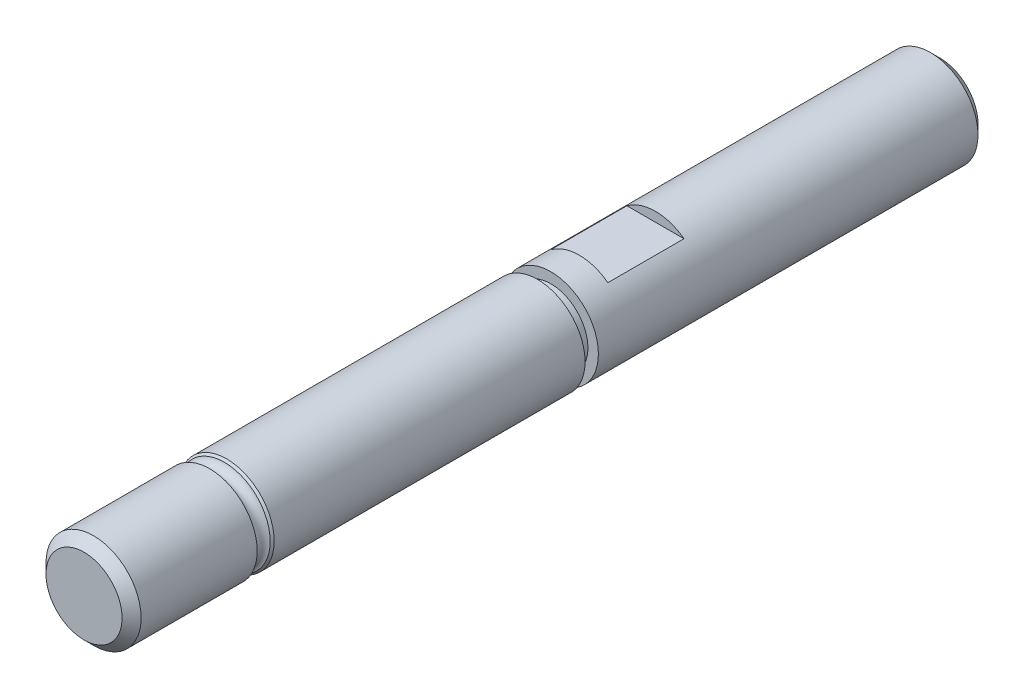
ISO-10303-21;
HEADER;
FILE_DESCRIPTION(('STEP AP214'),'2;1');
FILE_NAME('part.step','',(''),(''),'','','');
FILE_SCHEMA(('AUTOMOTIVE_DESIGN { 1 0 10303 214 1 1 1 1 }'));
ENDSEC;
DATA;
#1=APPLICATION_CONTEXT('core data for automotive mechanical design processes');
#2=APPLICATION_PROTOCOL_DEFINITION('international standard','automotive_design',2000,#1);
#3=PRODUCT_CONTEXT('',#1,'mechanical');
#4=PRODUCT('Part','Part','',(#3));
#5=PRODUCT_RELATED_PRODUCT_CATEGORY('part','',(#4));
#6=PRODUCT_DEFINITION_FORMATION('','',#4);
#7=PRODUCT_DEFINITION_CONTEXT('part definition',#1,'design');
#8=PRODUCT_DEFINITION('design','',#6,#7);
#9=PRODUCT_DEFINITION_SHAPE('','',#8);
#10=(LENGTH_UNIT() NAMED_UNIT(*) SI_UNIT(.MILLI.,.METRE.));
#11=(NAMED_UNIT(*) PLANE_ANGLE_UNIT() SI_UNIT($,.RADIAN.));
#12=(NAMED_UNIT(*) SI_UNIT($,.STERADIAN.) SOLID_ANGLE_UNIT());
#13=UNCERTAINTY_MEASURE_WITH_UNIT(LENGTH_MEASURE(1.E-05),#10,'distance_accuracy_value','');
#14=(GEOMETRIC_REPRESENTATION_CONTEXT(3) GLOBAL_UNCERTAINTY_ASSIGNED_CONTEXT((#13)) GLOBAL_UNIT_ASSIGNED_CONTEXT((#10,
#11,#12)) REPRESENTATION_CONTEXT('',''));
#15=CARTESIAN_POINT('',(0.,0.,0.));
#16=DIRECTION('',(0.,0.,1.));
#17=DIRECTION('',(1.,0.,0.));
#18=AXIS2_PLACEMENT_3D('',#15,#16,#17);
#19=CARTESIAN_POINT('',(0.,0.,45.));
#20=DIRECTION('',(0.,0.,-1.));
#21=DIRECTION('',(-1.,0.,0.));
#22=AXIS2_PLACEMENT_3D('',#19,#20,#21);
#23=PLANE('',#22);
#24=CARTESIAN_POINT('',(0.,0.,45.0000000001864));
#25=DIRECTION('',(0.,0.,-1.));
#26=DIRECTION('',(-1.,0.,0.));
#27=AXIS2_PLACEMENT_3D('',#24,#25,#26);
#28=CIRCLE('',#27,2.00000000018008);
#29=CARTESIAN_POINT('',(-2.00000000018008,0.,45.0000000001864));
#30=VERTEX_POINT('',#29);
#31=EDGE_CURVE('E20',#30,#30,#28,.T.);
#32=ORIENTED_EDGE('',*,*,#31,.F.);
#33=EDGE_LOOP('',(#32));
#34=FACE_BOUND('',#33,.T.);
#35=ADVANCED_FACE('F16',(#34),#23,.F.);
#36=CARTESIAN_POINT('',(0.,0.,44.4999999998004));
#37=DIRECTION('',(0.,0.,-1.));
#38=DIRECTION('',(-1.,0.,0.));
#39=AXIS2_PLACEMENT_3D('',#36,#37,#38);
#40=CONICAL_SURFACE('',#39,2.49999999965667,0.785398162487954);
#41=ORIENTED_EDGE('',*,*,#31,.T.);
#42=EDGE_LOOP('',(#41));
#43=FACE_BOUND('',#42,.T.);
#44=CARTESIAN_POINT('',(0.,0.,44.5));
#45=DIRECTION('',(0.,0.,1.));
#46=DIRECTION('',(-1.,0.,0.));
#47=AXIS2_PLACEMENT_3D('',#44,#45,#46);
#48=CIRCLE('',#47,2.50000000000001);
#49=CARTESIAN_POINT('',(-2.50000000000001,0.,44.5));
#50=VERTEX_POINT('',#49);
#51=EDGE_CURVE('E100',#50,#50,#48,.F.);
#52=ORIENTED_EDGE('',*,*,#51,.F.);
#53=EDGE_LOOP('',(#52));
#54=FACE_BOUND('',#53,.T.);
#55=ADVANCED_FACE('F280',(#43,#54),#40,.T.);
#56=CARTESIAN_POINT('',(0.,0.,38.396875));
#57=DIRECTION('',(0.,0.,1.));
#58=DIRECTION('',(1.,0.,0.));
#59=AXIS2_PLACEMENT_3D('',#56,#57,#58);
#60=CYLINDRICAL_SURFACE('',#59,2.50000000000001);
#61=ORIENTED_EDGE('',*,*,#51,.T.);
#62=EDGE_LOOP('',(#61));
#63=FACE_BOUND('',#62,.T.);
#64=CARTESIAN_POINT('',(0.,0.,38.396875));
#65=DIRECTION('',(0.,0.,1.));
#66=DIRECTION('',(1.,0.,0.));
#67=AXIS2_PLACEMENT_3D('',#64,#65,#66);
#68=CIRCLE('',#67,2.50000000000001);
#69=CARTESIAN_POINT('',(2.50000000000001,0.,38.396875));
#70=VERTEX_POINT('',#69);
#71=EDGE_CURVE('E95',#70,#70,#68,.T.);
#72=ORIENTED_EDGE('',*,*,#71,.T.);
#73=EDGE_LOOP('',(#72));
#74=FACE_BOUND('',#73,.T.);
#75=ADVANCED_FACE('F132',(#63,#74),#60,.T.);
#76=CARTESIAN_POINT('',(0.,0.,38.));
#77=DIRECTION('',(0.,0.,1.));
#78=DIRECTION('',(1.,0.,0.));
#79=AXIS2_PLACEMENT_3D('',#76,#77,#78);
#80=TOROIDAL_SURFACE('',#79,2.50000000000001,0.396875);
#81=ORIENTED_EDGE('',*,*,#71,.F.);
#82=EDGE_LOOP('',(#81));
#83=FACE_BOUND('',#82,.T.);
#84=CARTESIAN_POINT('',(0.,0.,37.6157232127525));
#85=DIRECTION('',(0.,0.,-1.));
#86=DIRECTION('',(-1.,0.,0.));
#87=AXIS2_PLACEMENT_3D('',#84,#85,#86);
#88=CIRCLE('',#87,2.40079759902301);
#89=CARTESIAN_POINT('',(-2.40079759902301,0.,37.6157232127525));
#90=VERTEX_POINT('',#89);
#91=EDGE_CURVE('E90',#90,#90,#88,.T.);
#92=ORIENTED_EDGE('',*,*,#91,.F.);
#93=EDGE_LOOP('',(#92));
#94=FACE_BOUND('',#93,.T.);
#95=ADVANCED_FACE('F127',(#83,#94),#80,.F.);
#96=CARTESIAN_POINT('',(0.,0.,37.5031250001712));
#97=DIRECTION('',(0.,0.,-1.));
#98=DIRECTION('',(-1.,0.,0.));
#99=AXIS2_PLACEMENT_3D('',#96,#97,#98);
#100=CONICAL_SURFACE('',#99,2.49999999971351,0.722235019773914);
#101=ORIENTED_EDGE('',*,*,#91,.T.);
#102=EDGE_LOOP('',(#101));
#103=FACE_BOUND('',#102,.T.);
#104=CARTESIAN_POINT('',(0.,0.,37.503125));
#105=DIRECTION('',(0.,0.,1.));
#106=DIRECTION('',(-1.,0.,0.));
#107=AXIS2_PLACEMENT_3D('',#104,#105,#106);
#108=CIRCLE('',#107,2.50000000000001);
#109=CARTESIAN_POINT('',(-2.50000000000001,0.,37.503125));
#110=VERTEX_POINT('',#109);
#111=EDGE_CURVE('E85',#110,#110,#108,.F.);
#112=ORIENTED_EDGE('',*,*,#111,.F.);
#113=EDGE_LOOP('',(#112));
#114=FACE_BOUND('',#113,.T.);
#115=ADVANCED_FACE('F131',(#103,#114),#100,.T.);
#116=CARTESIAN_POINT('',(0.,0.,21.1582));
#117=DIRECTION('',(0.,0.,1.));
#118=DIRECTION('',(1.,0.,0.));
#119=AXIS2_PLACEMENT_3D('',#116,#117,#118);
#120=CYLINDRICAL_SURFACE('',#119,2.50000000000001);
#121=ORIENTED_EDGE('',*,*,#111,.T.);
#122=EDGE_LOOP('',(#121));
#123=FACE_BOUND('',#122,.T.);
#124=CARTESIAN_POINT('',(0.,0.,21.1582));
#125=DIRECTION('',(0.,0.,1.));
#126=DIRECTION('',(1.,0.,0.));
#127=AXIS2_PLACEMENT_3D('',#124,#125,#126);
#128=CIRCLE('',#127,2.50000000000001);
#129=CARTESIAN_POINT('',(2.50000000000001,0.,21.1582));
#130=VERTEX_POINT('',#129);
#131=EDGE_CURVE('E83',#130,#130,#128,.T.);
#132=ORIENTED_EDGE('',*,*,#131,.T.);
#133=EDGE_LOOP('',(#132));
#134=FACE_BOUND('',#133,.T.);
#135=ADVANCED_FACE('F137',(#123,#134),#120,.T.);
#136=CARTESIAN_POINT('',(0.,-2.82662697178819,21.1582));
#137=DIRECTION('',(0.,0.,1.));
#138=DIRECTION('',(1.,0.,0.));
#139=AXIS2_PLACEMENT_3D('',#136,#137,#138);
#140=PLANE('',#139);
#141=CARTESIAN_POINT('',(0.,0.,21.1582));
#142=DIRECTION('',(0.,0.,-1.));
#143=DIRECTION('',(-1.,0.,0.));
#144=AXIS2_PLACEMENT_3D('',#141,#142,#143);
#145=CIRCLE('',#144,1.95);
#146=CARTESIAN_POINT('',(-1.95,0.,21.1582));
#147=VERTEX_POINT('',#146);
#148=EDGE_CURVE('E62',#147,#147,#145,.T.);
#149=ORIENTED_EDGE('',*,*,#148,.F.);
#150=EDGE_LOOP('',(#149));
#151=FACE_BOUND('',#150,.T.);
#152=ORIENTED_EDGE('',*,*,#131,.F.);
#153=EDGE_LOOP('',(#152));
#154=FACE_BOUND('',#153,.T.);
#155=ADVANCED_FACE('F141',(#151,#154),#140,.F.);
#156=CARTESIAN_POINT('',(0.,0.,0.));
#157=DIRECTION('',(0.,0.,-1.));
#158=DIRECTION('',(-1.,0.,0.));
#159=AXIS2_PLACEMENT_3D('',#156,#157,#158);
#160=PLANE('',#159);
#161=CARTESIAN_POINT('',(0.,0.,-1.70530256582424E-10));
#162=DIRECTION('',(0.,0.,1.));
#163=DIRECTION('',(1.,0.,0.));
#164=AXIS2_PLACEMENT_3D('',#161,#162,#163);
#165=CIRCLE('',#164,2.00000000023692);
#166=CARTESIAN_POINT('',(2.00000000023692,0.,-1.70530256582424E-10));
#167=VERTEX_POINT('',#166);
#168=EDGE_CURVE('E75',#167,#167,#165,.T.);
#169=ORIENTED_EDGE('',*,*,#168,.F.);
#170=EDGE_LOOP('',(#169));
#171=FACE_BOUND('',#170,.T.);
#172=ADVANCED_FACE('F144',(#171),#160,.T.);
#173=CARTESIAN_POINT('',(0.,5.21005866740841,14.9582));
#174=DIRECTION('',(0.,0.,-1.));
#175=DIRECTION('',(-1.,0.,0.));
#176=AXIS2_PLACEMENT_3D('',#173,#174,#175);
#177=PLANE('',#176);
#178=DIRECTION('',(1.,0.,0.));
#179=VECTOR('',#178,1.);
#180=CARTESIAN_POINT('',(0.,2.,14.9582));
#181=LINE('',#180,#179);
#182=CARTESIAN_POINT('',(-1.50000000000001,2.00000000000001,14.9582));
#183=VERTEX_POINT('',#182);
#184=CARTESIAN_POINT('',(1.50000000000001,2.00000000000001,14.9582));
#185=VERTEX_POINT('',#184);
#186=EDGE_CURVE('E56',#183,#185,#181,.T.);
#187=ORIENTED_EDGE('',*,*,#186,.T.);
#188=CARTESIAN_POINT('',(0.,0.,14.9582));
#189=DIRECTION('',(0.,0.,1.));
#190=DIRECTION('',(1.,0.,0.));
#191=AXIS2_PLACEMENT_3D('',#188,#189,#190);
#192=CIRCLE('',#191,2.50000000000001);
#193=EDGE_CURVE('E54',#183,#185,#192,.F.);
#194=ORIENTED_EDGE('',*,*,#193,.F.);
#195=EDGE_LOOP('',(#187,#194));
#196=FACE_BOUND('',#195,.T.);
#197=ADVANCED_FACE('F58',(#196),#177,.F.);
#198=CARTESIAN_POINT('',(0.,2.,18.9582));
#199=DIRECTION('',(0.,0.,1.));
#200=DIRECTION('',(1.,0.,0.));
#201=AXIS2_PLACEMENT_3D('',#198,#199,#200);
#202=PLANE('',#201);
#203=DIRECTION('',(1.,0.,0.));
#204=VECTOR('',#203,1.);
#205=CARTESIAN_POINT('',(0.,2.,18.9582));
#206=LINE('',#205,#204);
#207=CARTESIAN_POINT('',(1.50000000000001,2.00000000000001,18.9582));
#208=VERTEX_POINT('',#207);
#209=CARTESIAN_POINT('',(-1.50000000000001,2.00000000000001,18.9582));
#210=VERTEX_POINT('',#209);
#211=EDGE_CURVE('E63',#208,#210,#206,.F.);
#212=ORIENTED_EDGE('',*,*,#211,.T.);
#213=CARTESIAN_POINT('',(0.,0.,18.9582));
#214=DIRECTION('',(0.,0.,1.));
#215=DIRECTION('',(1.,0.,0.));
#216=AXIS2_PLACEMENT_3D('',#213,#214,#215);
#217=CIRCLE('',#216,2.50000000000001);
#218=EDGE_CURVE('E71',#208,#210,#217,.T.);
#219=ORIENTED_EDGE('',*,*,#218,.F.);
#220=EDGE_LOOP('',(#212,#219));
#221=FACE_BOUND('',#220,.T.);
#222=ADVANCED_FACE('F151',(#221),#202,.F.);
#223=CARTESIAN_POINT('',(0.,2.,14.9582));
#224=DIRECTION('',(0.,-1.,0.));
#225=DIRECTION('',(0.,0.,-1.));
#226=AXIS2_PLACEMENT_3D('',#223,#224,#225);
#227=PLANE('',#226);
#228=ORIENTED_EDGE('',*,*,#186,.F.);
#229=DIRECTION('',(0.,0.,1.));
#230=VECTOR('',#229,1.);
#231=CARTESIAN_POINT('',(-1.5,2.00000000000001,0.));
#232=LINE('',#231,#230);
#233=EDGE_CURVE('E74',#210,#183,#232,.F.);
#234=ORIENTED_EDGE('',*,*,#233,.F.);
#235=ORIENTED_EDGE('',*,*,#211,.F.);
#236=DIRECTION('',(0.,0.,1.));
#237=VECTOR('',#236,1.);
#238=CARTESIAN_POINT('',(1.5,2.00000000000001,0.));
#239=LINE('',#238,#237);
#240=EDGE_CURVE('E66',#185,#208,#239,.T.);
#241=ORIENTED_EDGE('',*,*,#240,.F.);
#242=EDGE_LOOP('',(#228,#234,#235,#241));
#243=FACE_BOUND('',#242,.T.);
#244=ADVANCED_FACE('F67',(#243),#227,.F.);
#245=CARTESIAN_POINT('',(0.,0.,21.1582));
#246=DIRECTION('',(0.,0.,-1.));
#247=DIRECTION('',(-1.,0.,0.));
#248=AXIS2_PLACEMENT_3D('',#245,#246,#247);
#249=CYLINDRICAL_SURFACE('',#248,1.95);
#250=ORIENTED_EDGE('',*,*,#148,.T.);
#251=EDGE_LOOP('',(#250));
#252=FACE_BOUND('',#251,.T.);
#253=CARTESIAN_POINT('',(0.,0.,20.4582));
#254=DIRECTION('',(0.,0.,-1.));
#255=DIRECTION('',(-1.,0.,0.));
#256=AXIS2_PLACEMENT_3D('',#253,#254,#255);
#257=CIRCLE('',#256,1.95);
#258=CARTESIAN_POINT('',(-1.95,0.,20.4582));
#259=VERTEX_POINT('',#258);
#260=EDGE_CURVE('E112',#259,#259,#257,.F.);
#261=ORIENTED_EDGE('',*,*,#260,.T.);
#262=EDGE_LOOP('',(#261));
#263=FACE_BOUND('',#262,.T.);
#264=ADVANCED_FACE('F157',(#252,#263),#249,.T.);
#265=CARTESIAN_POINT('',(0.,0.,0.50000000021555));
#266=DIRECTION('',(0.,0.,1.));
#267=DIRECTION('',(1.,0.,0.));
#268=AXIS2_PLACEMENT_3D('',#265,#266,#267);
#269=CONICAL_SURFACE('',#268,2.49999999971351,0.785398162487954);
#270=ORIENTED_EDGE('',*,*,#168,.T.);
#271=EDGE_LOOP('',(#270));
#272=FACE_BOUND('',#271,.T.);
#273=CARTESIAN_POINT('',(0.,0.,0.500000000000007));
#274=DIRECTION('',(0.,0.,1.));
#275=DIRECTION('',(-1.,0.,0.));
#276=AXIS2_PLACEMENT_3D('',#273,#274,#275);
#277=CIRCLE('',#276,2.50000000000001);
#278=CARTESIAN_POINT('',(-2.50000000000001,0.,0.500000000000007));
#279=VERTEX_POINT('',#278);
#280=EDGE_CURVE('E111',#279,#279,#277,.T.);
#281=ORIENTED_EDGE('',*,*,#280,.F.);
#282=EDGE_LOOP('',(#281));
#283=FACE_BOUND('',#282,.T.);
#284=ADVANCED_FACE('F160',(#272,#283),#269,.T.);
#285=CARTESIAN_POINT('',(0.,-2.82662697178819,20.4582));
#286=DIRECTION('',(0.,0.,-1.));
#287=DIRECTION('',(-1.,0.,0.));
#288=AXIS2_PLACEMENT_3D('',#285,#286,#287);
#289=PLANE('',#288);
#290=ORIENTED_EDGE('',*,*,#260,.F.);
#291=EDGE_LOOP('',(#290));
#292=FACE_BOUND('',#291,.T.);
#293=CARTESIAN_POINT('',(0.,0.,20.4582));
#294=DIRECTION('',(0.,0.,1.));
#295=DIRECTION('',(1.,0.,0.));
#296=AXIS2_PLACEMENT_3D('',#293,#294,#295);
#297=CIRCLE('',#296,2.50000000000001);
#298=CARTESIAN_POINT('',(2.50000000000001,0.,20.4582));
#299=VERTEX_POINT('',#298);
#300=EDGE_CURVE('E109',#299,#299,#297,.F.);
#301=ORIENTED_EDGE('',*,*,#300,.F.);
#302=EDGE_LOOP('',(#301));
#303=FACE_BOUND('',#302,.T.);
#304=ADVANCED_FACE('F164',(#292,#303),#289,.F.);
#305=CARTESIAN_POINT('',(1.49999999999999,-2.50500000000001,14.9582));
#306=DIRECTION('',(0.,0.,-1.));
#307=DIRECTION('',(-1.,0.,0.));
#308=AXIS2_PLACEMENT_3D('',#305,#306,#307);
#309=PLANE('',#308);
#310=DIRECTION('',(-1.,0.,0.));
#311=VECTOR('',#310,1.);
#312=CARTESIAN_POINT('',(0.,-2.,14.9582));
#313=LINE('',#312,#311);
#314=CARTESIAN_POINT('',(1.50000000000001,-2.00000000000001,14.9582));
#315=VERTEX_POINT('',#314);
#316=CARTESIAN_POINT('',(-1.50000000000001,-2.00000000000001,14.9582));
#317=VERTEX_POINT('',#316);
#318=EDGE_CURVE('E114',#315,#317,#313,.T.);
#319=ORIENTED_EDGE('',*,*,#318,.T.);
#320=CARTESIAN_POINT('',(0.,0.,14.9582));
#321=DIRECTION('',(0.,0.,1.));
#322=DIRECTION('',(1.,0.,0.));
#323=AXIS2_PLACEMENT_3D('',#320,#321,#322);
#324=CIRCLE('',#323,2.50000000000001);
#325=EDGE_CURVE('E106',#315,#317,#324,.F.);
#326=ORIENTED_EDGE('',*,*,#325,.F.);
#327=EDGE_LOOP('',(#319,#326));
#328=FACE_BOUND('',#327,.T.);
#329=ADVANCED_FACE('F168',(#328),#309,.F.);
#330=CARTESIAN_POINT('',(-1.49999999999999,-2.50500000000001,18.9582));
#331=DIRECTION('',(0.,0.,1.));
#332=DIRECTION('',(1.,0.,0.));
#333=AXIS2_PLACEMENT_3D('',#330,#331,#332);
#334=PLANE('',#333);
#335=DIRECTION('',(1.,0.,0.));
#336=VECTOR('',#335,1.);
#337=CARTESIAN_POINT('',(0.,-2.,18.9582));
#338=LINE('',#337,#336);
#339=CARTESIAN_POINT('',(-1.50000000000001,-2.00000000000001,18.9582));
#340=VERTEX_POINT('',#339);
#341=CARTESIAN_POINT('',(1.50000000000001,-2.00000000000001,18.9582));
#342=VERTEX_POINT('',#341);
#343=EDGE_CURVE('E34',#340,#342,#338,.T.);
#344=ORIENTED_EDGE('',*,*,#343,.T.);
#345=CARTESIAN_POINT('',(0.,0.,18.9582));
#346=DIRECTION('',(0.,0.,1.));
#347=DIRECTION('',(1.,0.,0.));
#348=AXIS2_PLACEMENT_3D('',#345,#346,#347);
#349=CIRCLE('',#348,2.50000000000001);
#350=EDGE_CURVE('E26',#340,#342,#349,.T.);
#351=ORIENTED_EDGE('',*,*,#350,.F.);
#352=EDGE_LOOP('',(#344,#351));
#353=FACE_BOUND('',#352,.T.);
#354=ADVANCED_FACE('F174',(#353),#334,.F.);
#355=CARTESIAN_POINT('',(1.49999999999999,-2.,18.9582));
#356=DIRECTION('',(0.,1.,0.));
#357=DIRECTION('',(0.,0.,-1.));
#358=AXIS2_PLACEMENT_3D('',#355,#356,#357);
#359=PLANE('',#358);
#360=ORIENTED_EDGE('',*,*,#343,.F.);
#361=DIRECTION('',(0.,0.,1.));
#362=VECTOR('',#361,1.);
#363=CARTESIAN_POINT('',(-1.5,-2.00000000000001,0.));
#364=LINE('',#363,#362);
#365=EDGE_CURVE('E105',#317,#340,#364,.T.);
#366=ORIENTED_EDGE('',*,*,#365,.F.);
#367=ORIENTED_EDGE('',*,*,#318,.F.);
#368=DIRECTION('',(0.,0.,1.));
#369=VECTOR('',#368,1.);
#370=CARTESIAN_POINT('',(1.5,-2.00000000000001,0.));
#371=LINE('',#370,#369);
#372=EDGE_CURVE('E11',#342,#315,#371,.F.);
#373=ORIENTED_EDGE('',*,*,#372,.F.);
#374=EDGE_LOOP('',(#360,#366,#367,#373));
#375=FACE_BOUND('',#374,.T.);
#376=ADVANCED_FACE('F18',(#375),#359,.F.);
#377=CARTESIAN_POINT('',(0.,0.,0.500000000000007));
#378=DIRECTION('',(0.,0.,1.));
#379=DIRECTION('',(1.,0.,0.));
#380=AXIS2_PLACEMENT_3D('',#377,#378,#379);
#381=CYLINDRICAL_SURFACE('',#380,2.50000000000001);
#382=ORIENTED_EDGE('',*,*,#280,.T.);
#383=EDGE_LOOP('',(#382));
#384=FACE_BOUND('',#383,.T.);
#385=ORIENTED_EDGE('',*,*,#350,.T.);
#386=ORIENTED_EDGE('',*,*,#372,.T.);
#387=ORIENTED_EDGE('',*,*,#325,.T.);
#388=ORIENTED_EDGE('',*,*,#365,.T.);
#389=EDGE_LOOP('',(#385,#386,#387,#388));
#390=FACE_BOUND('',#389,.T.);
#391=ORIENTED_EDGE('',*,*,#300,.T.);
#392=EDGE_LOOP('',(#391));
#393=FACE_BOUND('',#392,.T.);
#394=ORIENTED_EDGE('',*,*,#218,.T.);
#395=ORIENTED_EDGE('',*,*,#233,.T.);
#396=ORIENTED_EDGE('',*,*,#193,.T.);
#397=ORIENTED_EDGE('',*,*,#240,.T.);
#398=EDGE_LOOP('',(#394,#395,#396,#397));
#399=FACE_BOUND('',#398,.T.);
#400=ADVANCED_FACE('F73',(#384,#390,#393,#399),#381,.T.);
#401=CLOSED_SHELL('',(#35,#55,#75,#95,#115,#135,#155,#172,#197,#222,#244,#264,#284,#304,#329,
#354,#376,#400));
#402=MANIFOLD_SOLID_BREP('B1',#401);
#403=ADVANCED_BREP_SHAPE_REPRESENTATION('',(#18,#402),#14);
#404=SHAPE_DEFINITION_REPRESENTATION(#9,#403);
ENDSEC;
END-ISO-10303-21;
